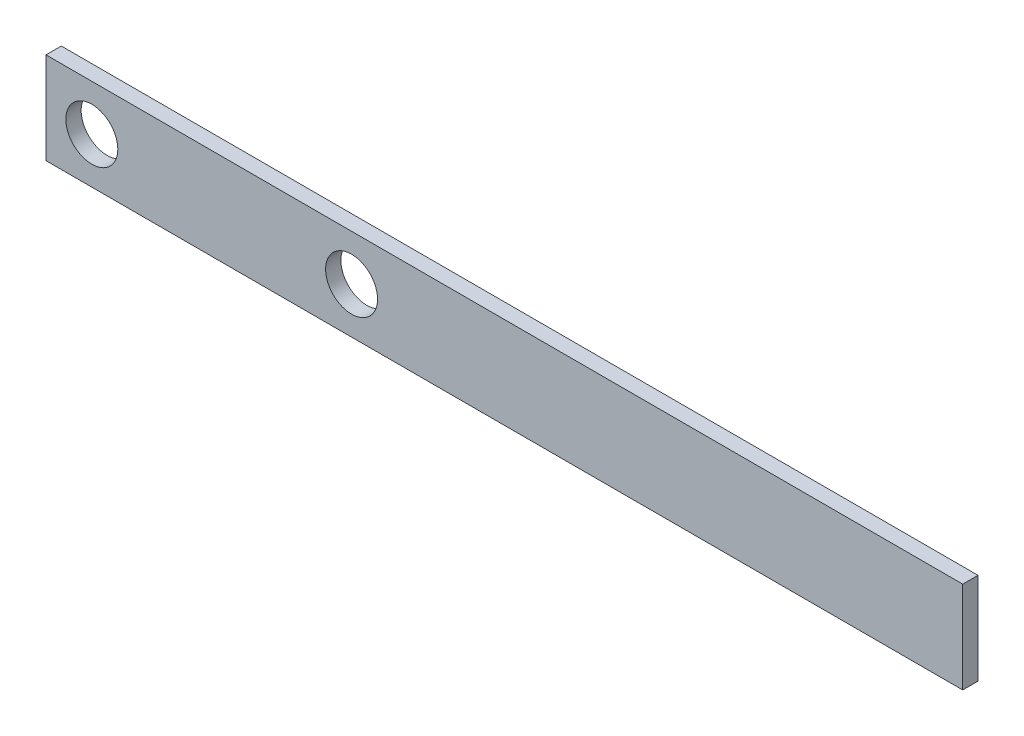
ISO-10303-21;
HEADER;
FILE_DESCRIPTION(('STEP AP214'),'2;1');
FILE_NAME('part.step','',(''),(''),'','','');
FILE_SCHEMA(('AUTOMOTIVE_DESIGN { 1 0 10303 214 1 1 1 1 }'));
ENDSEC;
DATA;
#1=APPLICATION_CONTEXT('core data for automotive mechanical design processes');
#2=APPLICATION_PROTOCOL_DEFINITION('international standard','automotive_design',2000,#1);
#3=PRODUCT_CONTEXT('',#1,'mechanical');
#4=PRODUCT('Part','Part','',(#3));
#5=PRODUCT_RELATED_PRODUCT_CATEGORY('part','',(#4));
#6=PRODUCT_DEFINITION_FORMATION('','',#4);
#7=PRODUCT_DEFINITION_CONTEXT('part definition',#1,'design');
#8=PRODUCT_DEFINITION('design','',#6,#7);
#9=PRODUCT_DEFINITION_SHAPE('','',#8);
#10=(LENGTH_UNIT() NAMED_UNIT(*) SI_UNIT(.MILLI.,.METRE.));
#11=(NAMED_UNIT(*) PLANE_ANGLE_UNIT() SI_UNIT($,.RADIAN.));
#12=(NAMED_UNIT(*) SI_UNIT($,.STERADIAN.) SOLID_ANGLE_UNIT());
#13=UNCERTAINTY_MEASURE_WITH_UNIT(LENGTH_MEASURE(1.E-05),#10,'distance_accuracy_value','');
#14=(GEOMETRIC_REPRESENTATION_CONTEXT(3) GLOBAL_UNCERTAINTY_ASSIGNED_CONTEXT((#13)) GLOBAL_UNIT_ASSIGNED_CONTEXT((#10,
#11,#12)) REPRESENTATION_CONTEXT('',''));
#15=CARTESIAN_POINT('',(0.,0.,0.));
#16=DIRECTION('',(0.,0.,1.));
#17=DIRECTION('',(1.,0.,0.));
#18=AXIS2_PLACEMENT_3D('',#15,#16,#17);
#19=CARTESIAN_POINT('',(-30.,-3.,1.));
#20=DIRECTION('',(1.,0.,0.));
#21=DIRECTION('',(0.,0.,-1.));
#22=AXIS2_PLACEMENT_3D('',#19,#20,#21);
#23=PLANE('',#22);
#24=DIRECTION('',(0.,-1.,0.));
#25=VECTOR('',#24,1.);
#26=CARTESIAN_POINT('',(-30.,-3.,0.));
#27=LINE('',#26,#25);
#28=CARTESIAN_POINT('',(-30.,3.,0.));
#29=VERTEX_POINT('',#28);
#30=CARTESIAN_POINT('',(-30.,-3.,0.));
#31=VERTEX_POINT('',#30);
#32=EDGE_CURVE('E111',#29,#31,#27,.T.);
#33=ORIENTED_EDGE('',*,*,#32,.T.);
#34=DIRECTION('',(0.,0.,-1.));
#35=VECTOR('',#34,1.);
#36=CARTESIAN_POINT('',(-30.,-3.,1.));
#37=LINE('',#36,#35);
#38=CARTESIAN_POINT('',(-30.,-3.,1.));
#39=VERTEX_POINT('',#38);
#40=EDGE_CURVE('E11',#39,#31,#37,.T.);
#41=ORIENTED_EDGE('',*,*,#40,.F.);
#42=DIRECTION('',(0.,-1.,0.));
#43=VECTOR('',#42,1.);
#44=CARTESIAN_POINT('',(-30.,-3.,1.));
#45=LINE('',#44,#43);
#46=CARTESIAN_POINT('',(-30.,3.,1.));
#47=VERTEX_POINT('',#46);
#48=EDGE_CURVE('E95',#47,#39,#45,.T.);
#49=ORIENTED_EDGE('',*,*,#48,.F.);
#50=DIRECTION('',(0.,0.,-1.));
#51=VECTOR('',#50,1.);
#52=CARTESIAN_POINT('',(-30.,3.,1.));
#53=LINE('',#52,#51);
#54=EDGE_CURVE('E107',#47,#29,#53,.T.);
#55=ORIENTED_EDGE('',*,*,#54,.T.);
#56=EDGE_LOOP('',(#33,#41,#49,#55));
#57=FACE_BOUND('',#56,.T.);
#58=ADVANCED_FACE('F43',(#57),#23,.F.);
#59=CARTESIAN_POINT('',(30.,-3.,1.));
#60=DIRECTION('',(0.,1.,0.));
#61=DIRECTION('',(-1.,0.,0.));
#62=AXIS2_PLACEMENT_3D('',#59,#60,#61);
#63=PLANE('',#62);
#64=DIRECTION('',(1.,0.,0.));
#65=VECTOR('',#64,1.);
#66=CARTESIAN_POINT('',(30.,-3.,0.));
#67=LINE('',#66,#65);
#68=CARTESIAN_POINT('',(30.,-3.,0.));
#69=VERTEX_POINT('',#68);
#70=EDGE_CURVE('E100',#31,#69,#67,.T.);
#71=ORIENTED_EDGE('',*,*,#70,.T.);
#72=DIRECTION('',(0.,0.,-1.));
#73=VECTOR('',#72,1.);
#74=CARTESIAN_POINT('',(30.,-3.,1.));
#75=LINE('',#74,#73);
#76=CARTESIAN_POINT('',(30.,-3.,1.));
#77=VERTEX_POINT('',#76);
#78=EDGE_CURVE('E52',#77,#69,#75,.T.);
#79=ORIENTED_EDGE('',*,*,#78,.F.);
#80=DIRECTION('',(1.,0.,0.));
#81=VECTOR('',#80,1.);
#82=CARTESIAN_POINT('',(30.,-3.,1.));
#83=LINE('',#82,#81);
#84=EDGE_CURVE('E90',#39,#77,#83,.T.);
#85=ORIENTED_EDGE('',*,*,#84,.F.);
#86=ORIENTED_EDGE('',*,*,#40,.T.);
#87=EDGE_LOOP('',(#71,#79,#85,#86));
#88=FACE_BOUND('',#87,.T.);
#89=ADVANCED_FACE('F99',(#88),#63,.F.);
#90=CARTESIAN_POINT('',(30.,-3.,1.));
#91=DIRECTION('',(-1.,0.,0.));
#92=DIRECTION('',(0.,0.,1.));
#93=AXIS2_PLACEMENT_3D('',#90,#91,#92);
#94=PLANE('',#93);
#95=DIRECTION('',(0.,1.,0.));
#96=VECTOR('',#95,1.);
#97=CARTESIAN_POINT('',(30.,-3.,0.));
#98=LINE('',#97,#96);
#99=CARTESIAN_POINT('',(30.,3.,0.));
#100=VERTEX_POINT('',#99);
#101=EDGE_CURVE('E77',#69,#100,#98,.T.);
#102=ORIENTED_EDGE('',*,*,#101,.T.);
#103=DIRECTION('',(0.,0.,-1.));
#104=VECTOR('',#103,1.);
#105=CARTESIAN_POINT('',(30.,3.,1.));
#106=LINE('',#105,#104);
#107=CARTESIAN_POINT('',(30.,3.,1.));
#108=VERTEX_POINT('',#107);
#109=EDGE_CURVE('E102',#108,#100,#106,.T.);
#110=ORIENTED_EDGE('',*,*,#109,.F.);
#111=DIRECTION('',(0.,1.,0.));
#112=VECTOR('',#111,1.);
#113=CARTESIAN_POINT('',(30.,-3.,1.));
#114=LINE('',#113,#112);
#115=EDGE_CURVE('E93',#77,#108,#114,.T.);
#116=ORIENTED_EDGE('',*,*,#115,.F.);
#117=ORIENTED_EDGE('',*,*,#78,.T.);
#118=EDGE_LOOP('',(#102,#110,#116,#117));
#119=FACE_BOUND('',#118,.T.);
#120=ADVANCED_FACE('F103',(#119),#94,.F.);
#121=CARTESIAN_POINT('',(30.,3.,1.));
#122=DIRECTION('',(0.,-1.,0.));
#123=DIRECTION('',(1.,0.,0.));
#124=AXIS2_PLACEMENT_3D('',#121,#122,#123);
#125=PLANE('',#124);
#126=DIRECTION('',(-1.,0.,0.));
#127=VECTOR('',#126,1.);
#128=CARTESIAN_POINT('',(30.,3.,0.));
#129=LINE('',#128,#127);
#130=EDGE_CURVE('E83',#100,#29,#129,.T.);
#131=ORIENTED_EDGE('',*,*,#130,.T.);
#132=ORIENTED_EDGE('',*,*,#54,.F.);
#133=DIRECTION('',(-1.,0.,0.));
#134=VECTOR('',#133,1.);
#135=CARTESIAN_POINT('',(30.,3.,1.));
#136=LINE('',#135,#134);
#137=EDGE_CURVE('E60',#108,#47,#136,.T.);
#138=ORIENTED_EDGE('',*,*,#137,.F.);
#139=ORIENTED_EDGE('',*,*,#109,.T.);
#140=EDGE_LOOP('',(#131,#132,#138,#139));
#141=FACE_BOUND('',#140,.T.);
#142=ADVANCED_FACE('F125',(#141),#125,.F.);
#143=CARTESIAN_POINT('',(0.,0.,1.));
#144=DIRECTION('',(0.,0.,1.));
#145=DIRECTION('',(1.,0.,0.));
#146=AXIS2_PLACEMENT_3D('',#143,#144,#145);
#147=PLANE('',#146);
#148=CARTESIAN_POINT('',(-27.,0.,1.));
#149=DIRECTION('',(0.,0.,1.));
#150=DIRECTION('',(1.,0.,0.));
#151=AXIS2_PLACEMENT_3D('',#148,#149,#150);
#152=CIRCLE('',#151,1.7);
#153=CARTESIAN_POINT('',(-25.3,0.,1.));
#154=VERTEX_POINT('',#153);
#155=EDGE_CURVE('E143',#154,#154,#152,.T.);
#156=ORIENTED_EDGE('',*,*,#155,.F.);
#157=EDGE_LOOP('',(#156));
#158=FACE_BOUND('',#157,.T.);
#159=CARTESIAN_POINT('',(-9.99999999999999,0.,1.));
#160=DIRECTION('',(0.,0.,1.));
#161=DIRECTION('',(1.,0.,0.));
#162=AXIS2_PLACEMENT_3D('',#159,#160,#161);
#163=CIRCLE('',#162,1.7);
#164=CARTESIAN_POINT('',(-8.3,0.,1.));
#165=VERTEX_POINT('',#164);
#166=EDGE_CURVE('E135',#165,#165,#163,.T.);
#167=ORIENTED_EDGE('',*,*,#166,.F.);
#168=EDGE_LOOP('',(#167));
#169=FACE_BOUND('',#168,.T.);
#170=ORIENTED_EDGE('',*,*,#48,.T.);
#171=ORIENTED_EDGE('',*,*,#84,.T.);
#172=ORIENTED_EDGE('',*,*,#115,.T.);
#173=ORIENTED_EDGE('',*,*,#137,.T.);
#174=EDGE_LOOP('',(#170,#171,#172,#173));
#175=FACE_BOUND('',#174,.T.);
#176=ADVANCED_FACE('F91',(#158,#169,#175),#147,.T.);
#177=CARTESIAN_POINT('',(0.,0.,0.));
#178=DIRECTION('',(0.,0.,1.));
#179=DIRECTION('',(1.,0.,0.));
#180=AXIS2_PLACEMENT_3D('',#177,#178,#179);
#181=PLANE('',#180);
#182=CARTESIAN_POINT('',(-27.,0.,0.));
#183=DIRECTION('',(0.,0.,1.));
#184=DIRECTION('',(1.,0.,0.));
#185=AXIS2_PLACEMENT_3D('',#182,#183,#184);
#186=CIRCLE('',#185,1.7);
#187=CARTESIAN_POINT('',(-25.3,0.,0.));
#188=VERTEX_POINT('',#187);
#189=EDGE_CURVE('E139',#188,#188,#186,.T.);
#190=ORIENTED_EDGE('',*,*,#189,.T.);
#191=EDGE_LOOP('',(#190));
#192=FACE_BOUND('',#191,.T.);
#193=CARTESIAN_POINT('',(-9.99999999999999,0.,0.));
#194=DIRECTION('',(0.,0.,1.));
#195=DIRECTION('',(1.,0.,0.));
#196=AXIS2_PLACEMENT_3D('',#193,#194,#195);
#197=CIRCLE('',#196,1.7);
#198=CARTESIAN_POINT('',(-8.3,0.,0.));
#199=VERTEX_POINT('',#198);
#200=EDGE_CURVE('E115',#199,#199,#197,.T.);
#201=ORIENTED_EDGE('',*,*,#200,.T.);
#202=EDGE_LOOP('',(#201));
#203=FACE_BOUND('',#202,.T.);
#204=ORIENTED_EDGE('',*,*,#32,.F.);
#205=ORIENTED_EDGE('',*,*,#130,.F.);
#206=ORIENTED_EDGE('',*,*,#101,.F.);
#207=ORIENTED_EDGE('',*,*,#70,.F.);
#208=EDGE_LOOP('',(#204,#205,#206,#207));
#209=FACE_BOUND('',#208,.T.);
#210=ADVANCED_FACE('F128',(#192,#203,#209),#181,.F.);
#211=CARTESIAN_POINT('',(-9.99999999999999,0.,1.));
#212=DIRECTION('',(0.,0.,1.));
#213=DIRECTION('',(1.,0.,0.));
#214=AXIS2_PLACEMENT_3D('',#211,#212,#213);
#215=CYLINDRICAL_SURFACE('',#214,1.7);
#216=ORIENTED_EDGE('',*,*,#200,.F.);
#217=EDGE_LOOP('',(#216));
#218=FACE_BOUND('',#217,.T.);
#219=ORIENTED_EDGE('',*,*,#166,.T.);
#220=EDGE_LOOP('',(#219));
#221=FACE_BOUND('',#220,.T.);
#222=ADVANCED_FACE('F155',(#218,#221),#215,.F.);
#223=CARTESIAN_POINT('',(-27.,0.,1.));
#224=DIRECTION('',(0.,0.,1.));
#225=DIRECTION('',(1.,0.,0.));
#226=AXIS2_PLACEMENT_3D('',#223,#224,#225);
#227=CYLINDRICAL_SURFACE('',#226,1.7);
#228=ORIENTED_EDGE('',*,*,#189,.F.);
#229=EDGE_LOOP('',(#228));
#230=FACE_BOUND('',#229,.T.);
#231=ORIENTED_EDGE('',*,*,#155,.T.);
#232=EDGE_LOOP('',(#231));
#233=FACE_BOUND('',#232,.T.);
#234=ADVANCED_FACE('F148',(#230,#233),#227,.F.);
#235=CLOSED_SHELL('',(#58,#89,#120,#142,#176,#210,#222,#234));
#236=MANIFOLD_SOLID_BREP('B2',#235);
#237=ADVANCED_BREP_SHAPE_REPRESENTATION('',(#18,#236),#14);
#238=SHAPE_DEFINITION_REPRESENTATION(#9,#237);
ENDSEC;
END-ISO-10303-21;
